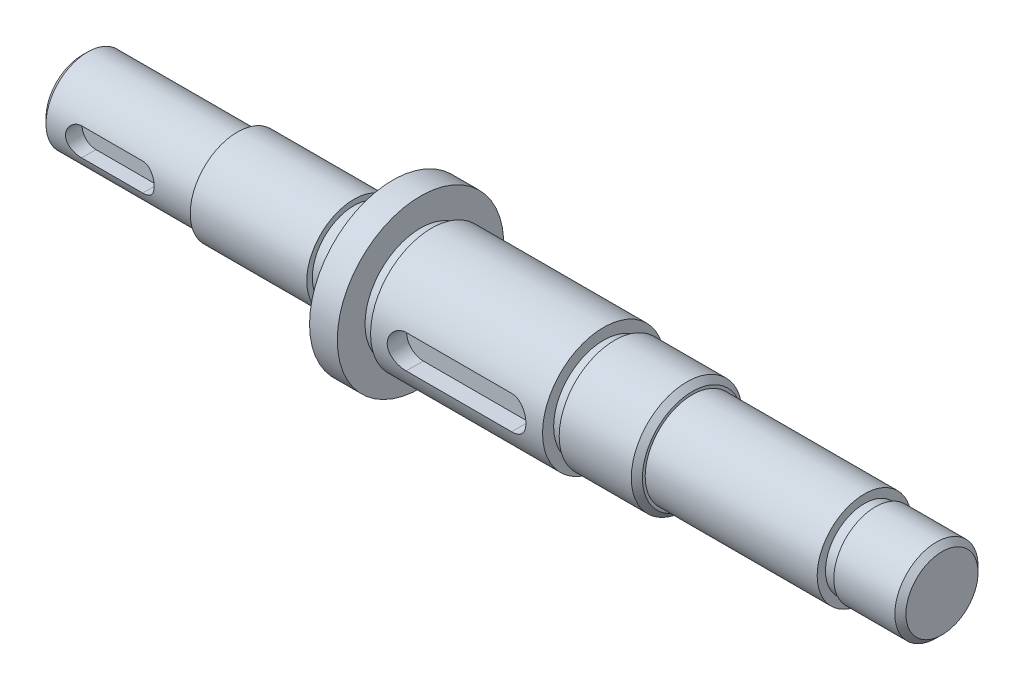
ISO-10303-21;
HEADER;
FILE_DESCRIPTION(('STEP AP214'),'2;1');
FILE_NAME('part.step','',(''),(''),'','','');
FILE_SCHEMA(('AUTOMOTIVE_DESIGN { 1 0 10303 214 1 1 1 1 }'));
ENDSEC;
DATA;
#1=APPLICATION_CONTEXT('core data for automotive mechanical design processes');
#2=APPLICATION_PROTOCOL_DEFINITION('international standard','automotive_design',2000,#1);
#3=PRODUCT_CONTEXT('',#1,'mechanical');
#4=PRODUCT('Part','Part','',(#3));
#5=PRODUCT_RELATED_PRODUCT_CATEGORY('part','',(#4));
#6=PRODUCT_DEFINITION_FORMATION('','',#4);
#7=PRODUCT_DEFINITION_CONTEXT('part definition',#1,'design');
#8=PRODUCT_DEFINITION('design','',#6,#7);
#9=PRODUCT_DEFINITION_SHAPE('','',#8);
#10=(LENGTH_UNIT() NAMED_UNIT(*) SI_UNIT(.MILLI.,.METRE.));
#11=(NAMED_UNIT(*) PLANE_ANGLE_UNIT() SI_UNIT($,.RADIAN.));
#12=(NAMED_UNIT(*) SI_UNIT($,.STERADIAN.) SOLID_ANGLE_UNIT());
#13=UNCERTAINTY_MEASURE_WITH_UNIT(LENGTH_MEASURE(1.E-05),#10,'distance_accuracy_value','');
#14=(GEOMETRIC_REPRESENTATION_CONTEXT(3) GLOBAL_UNCERTAINTY_ASSIGNED_CONTEXT((#13)) GLOBAL_UNIT_ASSIGNED_CONTEXT((#10,
#11,#12)) REPRESENTATION_CONTEXT('',''));
#15=CARTESIAN_POINT('',(0.,0.,0.));
#16=DIRECTION('',(0.,0.,1.));
#17=DIRECTION('',(1.,0.,0.));
#18=AXIS2_PLACEMENT_3D('',#15,#16,#17);
#19=CARTESIAN_POINT('',(0.,0.,0.));
#20=DIRECTION('',(1.,0.,0.));
#21=DIRECTION('',(0.,0.,-1.));
#22=AXIS2_PLACEMENT_3D('',#19,#20,#21);
#23=PLANE('',#22);
#24=CARTESIAN_POINT('',(0.,0.,0.));
#25=DIRECTION('',(1.,0.,0.));
#26=DIRECTION('',(0.,0.,-1.));
#27=AXIS2_PLACEMENT_3D('',#24,#25,#26);
#28=CIRCLE('',#27,6.49999999999998);
#29=CARTESIAN_POINT('',(0.,0.,-6.49999999999998));
#30=VERTEX_POINT('',#29);
#31=EDGE_CURVE('E368',#30,#30,#28,.F.);
#32=ORIENTED_EDGE('',*,*,#31,.T.);
#33=EDGE_LOOP('',(#32));
#34=FACE_BOUND('',#33,.T.);
#35=ADVANCED_FACE('F37',(#34),#23,.F.);
#36=CARTESIAN_POINT('',(0.,0.,0.));
#37=DIRECTION('',(-1.,0.,0.));
#38=DIRECTION('',(0.,0.,1.));
#39=AXIS2_PLACEMENT_3D('',#36,#37,#38);
#40=CYLINDRICAL_SURFACE('',#39,7.5);
#41=CARTESIAN_POINT('',(1.00000000000002,0.,0.));
#42=DIRECTION('',(1.,0.,0.));
#43=DIRECTION('',(0.,0.,-1.));
#44=AXIS2_PLACEMENT_3D('',#41,#42,#43);
#45=CIRCLE('',#44,7.5);
#46=CARTESIAN_POINT('',(1.00000000000002,0.,-7.5));
#47=VERTEX_POINT('',#46);
#48=EDGE_CURVE('E364',#47,#47,#45,.T.);
#49=ORIENTED_EDGE('',*,*,#48,.T.);
#50=EDGE_LOOP('',(#49));
#51=FACE_BOUND('',#50,.T.);
#52=DIRECTION('',(-1.,0.,0.));
#53=VECTOR('',#52,1.);
#54=CARTESIAN_POINT('',(0.,-2.5,7.07106781186547));
#55=LINE('',#54,#53);
#56=CARTESIAN_POINT('',(18.,-2.5,7.07106781186547));
#57=VERTEX_POINT('',#56);
#58=CARTESIAN_POINT('',(7.,-2.5,7.07106781186547));
#59=VERTEX_POINT('',#58);
#60=EDGE_CURVE('E687',#57,#59,#55,.T.);
#61=ORIENTED_EDGE('',*,*,#60,.T.);
#62=CARTESIAN_POINT('',(7.,-2.5,7.07106781186547));
#63=CARTESIAN_POINT('',(6.93179292217968,-2.50000899110406,7.07105693273157));
#64=CARTESIAN_POINT('',(6.86359192532461,-2.49720887221585,7.07205443904569));
#65=CARTESIAN_POINT('',(6.72771896165074,-2.48606045780471,7.07598524121007));
#66=CARTESIAN_POINT('',(6.66004685701195,-2.47771365997202,7.07891801450642));
#67=CARTESIAN_POINT('',(6.52590951164545,-2.45557459422796,7.08662705252507));
#68=CARTESIAN_POINT('',(6.45944129744913,-2.44179847763136,7.09139784850118));
#69=CARTESIAN_POINT('',(6.3279917314172,-2.4089418103012,7.10262619906002));
#70=CARTESIAN_POINT('',(6.2630104334101,-2.38986106786032,7.10908381460331));
#71=CARTESIAN_POINT('',(6.07103842028539,-2.32491551306196,7.13069940793912));
#72=CARTESIAN_POINT('',(5.94682084253002,-2.2713141681025,7.14811243884051));
#73=CARTESIAN_POINT('',(5.70912318853661,-2.14517784106255,7.1869703408752));
#74=CARTESIAN_POINT('',(5.59564976421981,-2.07263123268532,7.20841768551077));
#75=CARTESIAN_POINT('',(5.3782070965292,-1.90762995846819,7.25386182389479));
#76=CARTESIAN_POINT('',(5.2747148572318,-1.81456284630833,7.27792189428067));
#77=CARTESIAN_POINT('',(5.08448289676631,-1.61247071190512,7.32534626726038));
#78=CARTESIAN_POINT('',(4.997746158681,-1.50344285413658,7.34871044533518));
#79=CARTESIAN_POINT('',(4.84130177573754,-1.26900922493972,7.39284706096344));
#80=CARTESIAN_POINT('',(4.77209769225776,-1.14325025284461,7.41353593532888));
#81=CARTESIAN_POINT('',(4.6560192175653,-0.881073095475288,7.44924021883279));
#82=CARTESIAN_POINT('',(4.60913800507429,-0.744658181225883,7.46425736081204));
#83=CARTESIAN_POINT('',(4.54066072374174,-0.470073371182908,7.48647677762783));
#84=CARTESIAN_POINT('',(4.51824182904278,-0.332129588153742,7.49393272446142));
#85=CARTESIAN_POINT('',(4.49670924326149,-0.0542474216361983,7.50109021034827));
#86=CARTESIAN_POINT('',(4.49758999908424,0.0856904786402175,7.50079359709905));
#87=CARTESIAN_POINT('',(4.52211071040049,0.357759612692406,7.49265096581776));
#88=CARTESIAN_POINT('',(4.54485659560473,0.489981756428176,7.48510152476447));
#89=CARTESIAN_POINT('',(4.61098299597919,0.748610161077315,7.46367401253772));
#90=CARTESIAN_POINT('',(4.65436465532526,0.875016099077739,7.44979559044789));
#91=CARTESIAN_POINT('',(4.76105342419445,1.12038155754035,7.41689170677793));
#92=CARTESIAN_POINT('',(4.82461511285762,1.23922126412503,7.39780094595656));
#93=CARTESIAN_POINT('',(4.96964987842497,1.46481147275367,7.35645969200236));
#94=CARTESIAN_POINT('',(5.05112782760212,1.57155867428943,7.33420833994017));
#95=CARTESIAN_POINT('',(5.23417762500695,1.77524334927518,7.28765679856813));
#96=CARTESIAN_POINT('',(5.33651385902825,1.87148402903098,7.26330946699776));
#97=CARTESIAN_POINT('',(5.55610372428643,2.04568006205172,7.21618726182137));
#98=CARTESIAN_POINT('',(5.67336215600703,2.12362950795974,7.19341289789386));
#99=CARTESIAN_POINT('',(5.92170044588429,2.26000831398175,7.15175078440791));
#100=CARTESIAN_POINT('',(6.05295878733264,2.31813252376915,7.13292537370586));
#101=CARTESIAN_POINT('',(6.3241174439746,2.41115057675285,7.10202742655098));
#102=CARTESIAN_POINT('',(6.46400373343032,2.4460810901384,7.08994423522482));
#103=CARTESIAN_POINT('',(6.67104659186998,2.47914539070207,7.078413552368));
#104=CARTESIAN_POINT('',(6.73660347463558,2.48696265313779,7.07566669236505));
#105=CARTESIAN_POINT('',(6.86809519599952,2.49738654017799,7.07199258928497));
#106=CARTESIAN_POINT('',(6.93402943636098,2.49999988848745,7.0710629982382));
#107=CARTESIAN_POINT('',(7.,2.5,7.07106781186548));
#108=B_SPLINE_CURVE_WITH_KNOTS('',3,(#62,#63,#64,#65,#66,#67,#68,#69,#70,#71,#72,#73,#74,#75,
#76,#77,#78,#79,#80,#81,#82,#83,#84,#85,#86,#87,#88,#89,#90,#91,#92,#93,#94,#95,#96,#97,#98,#99,
#100,#101,#102,#103,#104,#105,#106,#107),.UNSPECIFIED.,.F.,.F.,(4,2,2,2,2,2,2,2,2,2,2,2,2,2,2,2,
2,2,2,2,2,2,4),(0.,0.20454621183858,0.409037215423655,0.612924429429075,0.816819012805389,
1.22401016923255,1.63145179965523,2.0532786408839,2.47518051341064,2.90809434014449,
3.34087579484514,3.75860278500203,4.17623021758302,4.57747647846034,4.97874498952315,
5.38529148746615,5.79194868153617,6.21771736826821,6.64362337304802,7.07581676501796,
7.50732520398794,7.70536340013574,7.90314555504337),.UNSPECIFIED.);
#109=CARTESIAN_POINT('',(7.,2.5,7.07106781186548));
#110=VERTEX_POINT('',#109);
#111=EDGE_CURVE('E220',#59,#110,#108,.T.);
#112=ORIENTED_EDGE('',*,*,#111,.T.);
#113=DIRECTION('',(-1.,0.,0.));
#114=VECTOR('',#113,1.);
#115=CARTESIAN_POINT('',(0.,2.5,7.07106781186548));
#116=LINE('',#115,#114);
#117=CARTESIAN_POINT('',(18.,2.5,7.07106781186548));
#118=VERTEX_POINT('',#117);
#119=EDGE_CURVE('E692',#110,#118,#116,.F.);
#120=ORIENTED_EDGE('',*,*,#119,.T.);
#121=CARTESIAN_POINT('',(18.,2.5,7.07106781186548));
#122=CARTESIAN_POINT('',(18.0682070778203,2.50000899110406,7.07105693273157));
#123=CARTESIAN_POINT('',(18.1364080746754,2.49720887221585,7.07205443904569));
#124=CARTESIAN_POINT('',(18.2722810383493,2.4860604578047,7.07598524121007));
#125=CARTESIAN_POINT('',(18.3399531429881,2.47771365997202,7.07891801450642));
#126=CARTESIAN_POINT('',(18.4740904883545,2.45557459422795,7.08662705252507));
#127=CARTESIAN_POINT('',(18.5405587025509,2.44179847763136,7.09139784850118));
#128=CARTESIAN_POINT('',(18.6720082685828,2.4089418103012,7.10262619906002));
#129=CARTESIAN_POINT('',(18.7369895665899,2.38986106786032,7.10908381460331));
#130=CARTESIAN_POINT('',(18.9289615797146,2.32491551306196,7.13069940793911));
#131=CARTESIAN_POINT('',(19.05317915747,2.2713141681025,7.14811243884051));
#132=CARTESIAN_POINT('',(19.2908768114634,2.14517784106255,7.1869703408752));
#133=CARTESIAN_POINT('',(19.4043502357802,2.07263123268532,7.20841768551077));
#134=CARTESIAN_POINT('',(19.6217929034708,1.90762995846819,7.25386182389479));
#135=CARTESIAN_POINT('',(19.7252851427682,1.81456284630833,7.27792189428067));
#136=CARTESIAN_POINT('',(19.9155171032337,1.61247071190512,7.32534626726038));
#137=CARTESIAN_POINT('',(20.002253841319,1.50344285413658,7.34871044533518));
#138=CARTESIAN_POINT('',(20.1586982242625,1.26900922493972,7.39284706096344));
#139=CARTESIAN_POINT('',(20.2279023077422,1.14325025284461,7.41353593532888));
#140=CARTESIAN_POINT('',(20.3439807824347,0.881073095475288,7.44924021883279));
#141=CARTESIAN_POINT('',(20.3908619949257,0.744658181225882,7.46425736081204));
#142=CARTESIAN_POINT('',(20.4593392762583,0.470073371182907,7.48647677762783));
#143=CARTESIAN_POINT('',(20.4817581709572,0.332129588153742,7.49393272446142));
#144=CARTESIAN_POINT('',(20.5032907567385,0.0542474216361993,7.50109021034827));
#145=CARTESIAN_POINT('',(20.5024100009158,-0.0856904786402162,7.50079359709905));
#146=CARTESIAN_POINT('',(20.4778892895995,-0.357759612692404,7.49265096581776));
#147=CARTESIAN_POINT('',(20.4551434043953,-0.489981756428174,7.48510152476447));
#148=CARTESIAN_POINT('',(20.3890170040208,-0.748610161077313,7.46367401253772));
#149=CARTESIAN_POINT('',(20.3456353446747,-0.875016099077738,7.44979559044789));
#150=CARTESIAN_POINT('',(20.2389465758055,-1.12038155754035,7.41689170677793));
#151=CARTESIAN_POINT('',(20.1753848871424,-1.23922126412503,7.39780094595656));
#152=CARTESIAN_POINT('',(20.030350121575,-1.46481147275367,7.35645969200236));
#153=CARTESIAN_POINT('',(19.9488721723979,-1.57155867428944,7.33420833994017));
#154=CARTESIAN_POINT('',(19.7658223749931,-1.77524334927518,7.28765679856813));
#155=CARTESIAN_POINT('',(19.6634861409718,-1.87148402903098,7.26330946699776));
#156=CARTESIAN_POINT('',(19.4438962757136,-2.04568006205173,7.21618726182137));
#157=CARTESIAN_POINT('',(19.326637843993,-2.12362950795974,7.19341289789385));
#158=CARTESIAN_POINT('',(19.0782995541157,-2.26000831398175,7.15175078440791));
#159=CARTESIAN_POINT('',(18.9470412126674,-2.31813252376915,7.13292537370586));
#160=CARTESIAN_POINT('',(18.6758825560254,-2.41115057675285,7.10202742655098));
#161=CARTESIAN_POINT('',(18.5359962665697,-2.4460810901384,7.08994423522482));
#162=CARTESIAN_POINT('',(18.32895340813,-2.47914539070207,7.078413552368));
#163=CARTESIAN_POINT('',(18.2633965253644,-2.48696265313779,7.07566669236505));
#164=CARTESIAN_POINT('',(18.1319048040005,-2.497386540178,7.07199258928497));
#165=CARTESIAN_POINT('',(18.065970563639,-2.49999988848745,7.0710629982382));
#166=CARTESIAN_POINT('',(18.,-2.5,7.07106781186547));
#167=B_SPLINE_CURVE_WITH_KNOTS('',3,(#121,#122,#123,#124,#125,#126,#127,#128,#129,#130,#131,
#132,#133,#134,#135,#136,#137,#138,#139,#140,#141,#142,#143,#144,#145,#146,#147,#148,#149,#150,
#151,#152,#153,#154,#155,#156,#157,#158,#159,#160,#161,#162,#163,#164,#165,#166),.UNSPECIFIED.,
.F.,.F.,(4,2,2,2,2,2,2,2,2,2,2,2,2,2,2,2,2,2,2,2,2,2,4),(0.,0.204546211838584,0.409037215423656,
0.612924429429074,0.816819012805387,1.22401016923255,1.63145179965523,2.0532786408839,
2.47518051341064,2.90809434014449,3.34087579484514,3.75860278500203,4.17623021758301,
4.57747647846033,4.97874498952315,5.38529148746615,5.79194868153617,6.21771736826821,
6.64362337304801,7.07581676501795,7.50732520398793,7.70536340013574,7.90314555504337),.UNSPECIFIED.);
#168=EDGE_CURVE('E61',#118,#57,#167,.T.);
#169=ORIENTED_EDGE('',*,*,#168,.T.);
#170=EDGE_LOOP('',(#61,#112,#120,#169));
#171=FACE_BOUND('',#170,.T.);
#172=CARTESIAN_POINT('',(28.,0.,0.));
#173=DIRECTION('',(-1.,0.,0.));
#174=DIRECTION('',(0.,0.,1.));
#175=AXIS2_PLACEMENT_3D('',#172,#173,#174);
#176=CIRCLE('',#175,7.5);
#177=CARTESIAN_POINT('',(28.,0.,7.5));
#178=VERTEX_POINT('',#177);
#179=EDGE_CURVE('E217',#178,#178,#176,.T.);
#180=ORIENTED_EDGE('',*,*,#179,.T.);
#181=EDGE_LOOP('',(#180));
#182=FACE_BOUND('',#181,.T.);
#183=ADVANCED_FACE('F235',(#51,#171,#182),#40,.T.);
#184=CARTESIAN_POINT('',(28.,7.5,0.));
#185=DIRECTION('',(1.,0.,0.));
#186=DIRECTION('',(0.,0.,-1.));
#187=AXIS2_PLACEMENT_3D('',#184,#185,#186);
#188=PLANE('',#187);
#189=ORIENTED_EDGE('',*,*,#179,.F.);
#190=EDGE_LOOP('',(#189));
#191=FACE_BOUND('',#190,.T.);
#192=CARTESIAN_POINT('',(28.,0.,0.));
#193=DIRECTION('',(-1.,0.,0.));
#194=DIRECTION('',(0.,0.,1.));
#195=AXIS2_PLACEMENT_3D('',#192,#193,#194);
#196=CIRCLE('',#195,8.5);
#197=CARTESIAN_POINT('',(28.,0.,8.5));
#198=VERTEX_POINT('',#197);
#199=EDGE_CURVE('E214',#198,#198,#196,.T.);
#200=ORIENTED_EDGE('',*,*,#199,.T.);
#201=EDGE_LOOP('',(#200));
#202=FACE_BOUND('',#201,.T.);
#203=ADVANCED_FACE('F337',(#191,#202),#188,.F.);
#204=CARTESIAN_POINT('',(0.,0.,0.));
#205=DIRECTION('',(-1.,0.,0.));
#206=DIRECTION('',(0.,0.,1.));
#207=AXIS2_PLACEMENT_3D('',#204,#205,#206);
#208=CYLINDRICAL_SURFACE('',#207,8.5);
#209=ORIENTED_EDGE('',*,*,#199,.F.);
#210=EDGE_LOOP('',(#209));
#211=FACE_BOUND('',#210,.T.);
#212=CARTESIAN_POINT('',(49.,0.,0.));
#213=DIRECTION('',(-1.,0.,0.));
#214=DIRECTION('',(0.,0.,1.));
#215=AXIS2_PLACEMENT_3D('',#212,#213,#214);
#216=CIRCLE('',#215,8.5);
#217=CARTESIAN_POINT('',(49.,0.,8.5));
#218=VERTEX_POINT('',#217);
#219=EDGE_CURVE('E211',#218,#218,#216,.T.);
#220=ORIENTED_EDGE('',*,*,#219,.T.);
#221=EDGE_LOOP('',(#220));
#222=FACE_BOUND('',#221,.T.);
#223=ADVANCED_FACE('F580',(#211,#222),#208,.T.);
#224=CARTESIAN_POINT('',(49.,8.5,0.));
#225=DIRECTION('',(-1.,0.,0.));
#226=DIRECTION('',(0.,0.,1.));
#227=AXIS2_PLACEMENT_3D('',#224,#225,#226);
#228=PLANE('',#227);
#229=ORIENTED_EDGE('',*,*,#219,.F.);
#230=EDGE_LOOP('',(#229));
#231=FACE_BOUND('',#230,.T.);
#232=CARTESIAN_POINT('',(49.,0.,0.));
#233=DIRECTION('',(-1.,0.,0.));
#234=DIRECTION('',(0.,0.,1.));
#235=AXIS2_PLACEMENT_3D('',#232,#233,#234);
#236=CIRCLE('',#235,7.5);
#237=CARTESIAN_POINT('',(49.,0.,7.5));
#238=VERTEX_POINT('',#237);
#239=EDGE_CURVE('E208',#238,#238,#236,.T.);
#240=ORIENTED_EDGE('',*,*,#239,.T.);
#241=EDGE_LOOP('',(#240));
#242=FACE_BOUND('',#241,.T.);
#243=ADVANCED_FACE('F570',(#231,#242),#228,.F.);
#244=CARTESIAN_POINT('',(0.,0.,0.));
#245=DIRECTION('',(-1.,0.,0.));
#246=DIRECTION('',(0.,0.,1.));
#247=AXIS2_PLACEMENT_3D('',#244,#245,#246);
#248=CYLINDRICAL_SURFACE('',#247,7.5);
#249=ORIENTED_EDGE('',*,*,#239,.F.);
#250=EDGE_LOOP('',(#249));
#251=FACE_BOUND('',#250,.T.);
#252=CARTESIAN_POINT('',(51.,0.,0.));
#253=DIRECTION('',(-1.,0.,0.));
#254=DIRECTION('',(0.,0.,1.));
#255=AXIS2_PLACEMENT_3D('',#252,#253,#254);
#256=CIRCLE('',#255,7.5);
#257=CARTESIAN_POINT('',(51.,0.,7.5));
#258=VERTEX_POINT('',#257);
#259=EDGE_CURVE('E205',#258,#258,#256,.T.);
#260=ORIENTED_EDGE('',*,*,#259,.T.);
#261=EDGE_LOOP('',(#260));
#262=FACE_BOUND('',#261,.T.);
#263=ADVANCED_FACE('F560',(#251,#262),#248,.T.);
#264=CARTESIAN_POINT('',(51.,7.5,0.));
#265=DIRECTION('',(-1.,0.,0.));
#266=DIRECTION('',(0.,0.,1.));
#267=AXIS2_PLACEMENT_3D('',#264,#265,#266);
#268=PLANE('',#267);
#269=ORIENTED_EDGE('',*,*,#259,.F.);
#270=EDGE_LOOP('',(#269));
#271=FACE_BOUND('',#270,.T.);
#272=CARTESIAN_POINT('',(51.,0.,0.));
#273=DIRECTION('',(-1.,0.,0.));
#274=DIRECTION('',(0.,0.,1.));
#275=AXIS2_PLACEMENT_3D('',#272,#273,#274);
#276=CIRCLE('',#275,5.);
#277=CARTESIAN_POINT('',(51.,0.,5.));
#278=VERTEX_POINT('',#277);
#279=EDGE_CURVE('E202',#278,#278,#276,.T.);
#280=ORIENTED_EDGE('',*,*,#279,.T.);
#281=EDGE_LOOP('',(#280));
#282=FACE_BOUND('',#281,.T.);
#283=ADVANCED_FACE('F550',(#271,#282),#268,.F.);
#284=CARTESIAN_POINT('',(0.,0.,0.));
#285=DIRECTION('',(-1.,0.,0.));
#286=DIRECTION('',(0.,0.,1.));
#287=AXIS2_PLACEMENT_3D('',#284,#285,#286);
#288=CYLINDRICAL_SURFACE('',#287,5.);
#289=ORIENTED_EDGE('',*,*,#279,.F.);
#290=EDGE_LOOP('',(#289));
#291=FACE_BOUND('',#290,.T.);
#292=CARTESIAN_POINT('',(56.,0.,0.));
#293=DIRECTION('',(-1.,0.,0.));
#294=DIRECTION('',(0.,0.,1.));
#295=AXIS2_PLACEMENT_3D('',#292,#293,#294);
#296=CIRCLE('',#295,5.);
#297=CARTESIAN_POINT('',(56.,0.,5.));
#298=VERTEX_POINT('',#297);
#299=EDGE_CURVE('E199',#298,#298,#296,.T.);
#300=ORIENTED_EDGE('',*,*,#299,.T.);
#301=EDGE_LOOP('',(#300));
#302=FACE_BOUND('',#301,.T.);
#303=ADVANCED_FACE('F540',(#291,#302),#288,.T.);
#304=CARTESIAN_POINT('',(56.,5.,0.));
#305=DIRECTION('',(1.,0.,0.));
#306=DIRECTION('',(0.,0.,-1.));
#307=AXIS2_PLACEMENT_3D('',#304,#305,#306);
#308=PLANE('',#307);
#309=ORIENTED_EDGE('',*,*,#299,.F.);
#310=EDGE_LOOP('',(#309));
#311=FACE_BOUND('',#310,.T.);
#312=CARTESIAN_POINT('',(56.,0.,0.));
#313=DIRECTION('',(-1.,0.,0.));
#314=DIRECTION('',(0.,0.,1.));
#315=AXIS2_PLACEMENT_3D('',#312,#313,#314);
#316=CIRCLE('',#315,15.);
#317=CARTESIAN_POINT('',(56.,0.,15.));
#318=VERTEX_POINT('',#317);
#319=EDGE_CURVE('E196',#318,#318,#316,.T.);
#320=ORIENTED_EDGE('',*,*,#319,.T.);
#321=EDGE_LOOP('',(#320));
#322=FACE_BOUND('',#321,.T.);
#323=ADVANCED_FACE('F530',(#311,#322),#308,.F.);
#324=CARTESIAN_POINT('',(0.,0.,0.));
#325=DIRECTION('',(-1.,0.,0.));
#326=DIRECTION('',(0.,0.,1.));
#327=AXIS2_PLACEMENT_3D('',#324,#325,#326);
#328=CYLINDRICAL_SURFACE('',#327,15.);
#329=ORIENTED_EDGE('',*,*,#319,.F.);
#330=EDGE_LOOP('',(#329));
#331=FACE_BOUND('',#330,.T.);
#332=CARTESIAN_POINT('',(61.,0.,0.));
#333=DIRECTION('',(-1.,0.,0.));
#334=DIRECTION('',(0.,0.,1.));
#335=AXIS2_PLACEMENT_3D('',#332,#333,#334);
#336=CIRCLE('',#335,15.);
#337=CARTESIAN_POINT('',(61.,0.,15.));
#338=VERTEX_POINT('',#337);
#339=EDGE_CURVE('E193',#338,#338,#336,.T.);
#340=ORIENTED_EDGE('',*,*,#339,.T.);
#341=EDGE_LOOP('',(#340));
#342=FACE_BOUND('',#341,.T.);
#343=ADVANCED_FACE('F520',(#331,#342),#328,.T.);
#344=CARTESIAN_POINT('',(61.,15.,0.));
#345=DIRECTION('',(-1.,0.,0.));
#346=DIRECTION('',(0.,0.,1.));
#347=AXIS2_PLACEMENT_3D('',#344,#345,#346);
#348=PLANE('',#347);
#349=ORIENTED_EDGE('',*,*,#339,.F.);
#350=EDGE_LOOP('',(#349));
#351=FACE_BOUND('',#350,.T.);
#352=CARTESIAN_POINT('',(61.,0.,0.));
#353=DIRECTION('',(-1.,0.,0.));
#354=DIRECTION('',(0.,0.,1.));
#355=AXIS2_PLACEMENT_3D('',#352,#353,#354);
#356=CIRCLE('',#355,10.);
#357=CARTESIAN_POINT('',(61.,0.,10.));
#358=VERTEX_POINT('',#357);
#359=EDGE_CURVE('E190',#358,#358,#356,.T.);
#360=ORIENTED_EDGE('',*,*,#359,.T.);
#361=EDGE_LOOP('',(#360));
#362=FACE_BOUND('',#361,.T.);
#363=ADVANCED_FACE('F511',(#351,#362),#348,.F.);
#364=CARTESIAN_POINT('',(0.,0.,0.));
#365=DIRECTION('',(-1.,0.,0.));
#366=DIRECTION('',(0.,0.,1.));
#367=AXIS2_PLACEMENT_3D('',#364,#365,#366);
#368=CYLINDRICAL_SURFACE('',#367,10.);
#369=ORIENTED_EDGE('',*,*,#359,.F.);
#370=EDGE_LOOP('',(#369));
#371=FACE_BOUND('',#370,.T.);
#372=CARTESIAN_POINT('',(63.,0.,0.));
#373=DIRECTION('',(-1.,0.,0.));
#374=DIRECTION('',(0.,0.,1.));
#375=AXIS2_PLACEMENT_3D('',#372,#373,#374);
#376=CIRCLE('',#375,10.);
#377=CARTESIAN_POINT('',(63.,0.,10.));
#378=VERTEX_POINT('',#377);
#379=EDGE_CURVE('E187',#378,#378,#376,.T.);
#380=ORIENTED_EDGE('',*,*,#379,.T.);
#381=EDGE_LOOP('',(#380));
#382=FACE_BOUND('',#381,.T.);
#383=ADVANCED_FACE('F502',(#371,#382),#368,.T.);
#384=CARTESIAN_POINT('',(63.,10.,0.));
#385=DIRECTION('',(1.,0.,0.));
#386=DIRECTION('',(0.,0.,-1.));
#387=AXIS2_PLACEMENT_3D('',#384,#385,#386);
#388=PLANE('',#387);
#389=ORIENTED_EDGE('',*,*,#379,.F.);
#390=EDGE_LOOP('',(#389));
#391=FACE_BOUND('',#390,.T.);
#392=CARTESIAN_POINT('',(63.,0.,0.));
#393=DIRECTION('',(-1.,0.,0.));
#394=DIRECTION('',(0.,0.,1.));
#395=AXIS2_PLACEMENT_3D('',#392,#393,#394);
#396=CIRCLE('',#395,11.);
#397=CARTESIAN_POINT('',(63.,0.,11.));
#398=VERTEX_POINT('',#397);
#399=EDGE_CURVE('E184',#398,#398,#396,.T.);
#400=ORIENTED_EDGE('',*,*,#399,.T.);
#401=EDGE_LOOP('',(#400));
#402=FACE_BOUND('',#401,.T.);
#403=ADVANCED_FACE('F303',(#391,#402),#388,.F.);
#404=CARTESIAN_POINT('',(0.,0.,0.));
#405=DIRECTION('',(-1.,0.,0.));
#406=DIRECTION('',(0.,0.,1.));
#407=AXIS2_PLACEMENT_3D('',#404,#405,#406);
#408=CYLINDRICAL_SURFACE('',#407,11.);
#409=DIRECTION('',(-1.,0.,0.));
#410=VECTOR('',#409,1.);
#411=CARTESIAN_POINT('',(0.,-3.,10.5830052442584));
#412=LINE('',#411,#410);
#413=CARTESIAN_POINT('',(88.,-3.,10.5830052442584));
#414=VERTEX_POINT('',#413);
#415=CARTESIAN_POINT('',(69.,-3.,10.5830052442584));
#416=VERTEX_POINT('',#415);
#417=EDGE_CURVE('E377',#414,#416,#412,.T.);
#418=ORIENTED_EDGE('',*,*,#417,.T.);
#419=CARTESIAN_POINT('',(69.,-3.,10.5830052442584));
#420=CARTESIAN_POINT('',(68.9173061085902,-3.00000989976809,10.5829949970026));
#421=CARTESIAN_POINT('',(68.834618295408,-2.99658102723595,10.5839742471726));
#422=CARTESIAN_POINT('',(68.6698664337712,-2.98292268314841,10.5878356752194));
#423=CARTESIAN_POINT('',(68.5878022683709,-2.97269452008914,10.5907174869552));
#424=CARTESIAN_POINT('',(68.4250574878552,-2.94554459027321,10.598299618142));
#425=CARTESIAN_POINT('',(68.3443742106137,-2.9286377012691,10.6029958951229));
#426=CARTESIAN_POINT('',(68.1847967459457,-2.88829120712689,10.6140571066224));
#427=CARTESIAN_POINT('',(68.1059025925916,-2.8648514776895,10.6204220728906));
#428=CARTESIAN_POINT('',(67.872757092836,-2.78500332821793,10.6417494872311));
#429=CARTESIAN_POINT('',(67.7218606051448,-2.71903526586307,10.6589535681767));
#430=CARTESIAN_POINT('',(67.4332946582313,-2.56365897700126,10.6973836998985));
#431=CARTESIAN_POINT('',(67.295629902896,-2.47424245636572,10.7186111730805));
#432=CARTESIAN_POINT('',(67.0337902940215,-2.27200424315806,10.7633148792344));
#433=CARTESIAN_POINT('',(66.9100081217563,-2.15868225262836,10.7868322128172));
#434=CARTESIAN_POINT('',(66.6829485610947,-1.91292298422355,10.8331129950831));
#435=CARTESIAN_POINT('',(66.5796745227067,-1.78048258944453,10.8558763200935));
#436=CARTESIAN_POINT('',(66.3949010932536,-1.49749198480952,10.8985459264206));
#437=CARTESIAN_POINT('',(66.313796920179,-1.34667477161624,10.9183977479742));
#438=CARTESIAN_POINT('',(66.1782515862203,-1.03291980522387,10.9525311229674));
#439=CARTESIAN_POINT('',(66.1238044788681,-0.869984764533407,10.9668139185607));
#440=CARTESIAN_POINT('',(66.0443982650973,-0.540744675896728,10.9879090070619));
#441=CARTESIAN_POINT('',(66.0187656736306,-0.374613167612542,10.9948916417093));
#442=CARTESIAN_POINT('',(65.995595335153,-0.0402673813620229,11.0011960589752));
#443=CARTESIAN_POINT('',(65.9980532838217,0.127946573564695,11.0005190152883));
#444=CARTESIAN_POINT('',(66.0305248758153,0.456980924404257,10.9917041066205));
#445=CARTESIAN_POINT('',(66.0598100267733,0.617879308918087,10.9837634920705));
#446=CARTESIAN_POINT('',(66.1439252158588,0.932383527853144,10.9615477415639));
#447=CARTESIAN_POINT('',(66.1987564916847,1.08598900853898,10.9472722986892));
#448=CARTESIAN_POINT('',(66.332954866807,1.38338788045077,10.9137016176963));
#449=CARTESIAN_POINT('',(66.4125682462387,1.52706425574145,10.8943563157114));
#450=CARTESIAN_POINT('',(66.5938798699065,1.79926098198643,10.8527253375081));
#451=CARTESIAN_POINT('',(66.6955821728122,1.92777854091953,10.830439121215));
#452=CARTESIAN_POINT('',(66.9220232350838,2.17034844112028,10.7844948742978));
#453=CARTESIAN_POINT('',(67.047394553869,2.2838069302889,10.760815765188));
#454=CARTESIAN_POINT('',(67.3156623808701,2.48826234185506,10.7153886222241));
#455=CARTESIAN_POINT('',(67.458563752454,2.57925300980782,10.6936411271564));
#456=CARTESIAN_POINT('',(67.759194812754,2.73667910615422,10.6544469945807));
#457=CARTESIAN_POINT('',(67.9170242427571,2.80293223890785,10.6370325899538));
#458=CARTESIAN_POINT('',(68.242087094527,2.9076832432578,10.6088816209578));
#459=CARTESIAN_POINT('',(68.4093059422751,2.94622291362359,10.598135003286));
#460=CARTESIAN_POINT('',(68.6483544398666,2.98015870664206,10.588613232355));
#461=CARTESIAN_POINT('',(68.7185164597237,2.98759962141261,10.5865140551644));
#462=CARTESIAN_POINT('',(68.8591075532403,2.99751512863222,10.58371035186));
#463=CARTESIAN_POINT('',(68.9295360350585,2.99999749605757,10.5830036423878));
#464=CARTESIAN_POINT('',(69.,3.,10.5830052442584));
#465=B_SPLINE_CURVE_WITH_KNOTS('',3,(#419,#420,#421,#422,#423,#424,#425,#426,#427,#428,#429,
#430,#431,#432,#433,#434,#435,#436,#437,#438,#439,#440,#441,#442,#443,#444,#445,#446,#447,#448,
#449,#450,#451,#452,#453,#454,#455,#456,#457,#458,#459,#460,#461,#462,#463,#464),.UNSPECIFIED.,
.F.,.F.,(4,2,2,2,2,2,2,2,2,2,2,2,2,2,2,2,2,2,2,2,2,2,4),(0.,0.247994395628699,0.495941079544131,
0.743338515979078,0.99074065992621,1.48499724217182,1.97942888795732,2.48547083856629,
2.99159538337129,3.50622794981869,4.02074566333957,4.52296979924472,5.02511698025349,
5.51402000992995,6.00294672920888,6.49689640600088,6.99093691914144,7.50077286033219,
8.01075056671345,8.52441550873707,9.03730408243458,9.24891043373584,9.46018472611219),.UNSPECIFIED.);
#466=CARTESIAN_POINT('',(69.,3.,10.5830052442584));
#467=VERTEX_POINT('',#466);
#468=EDGE_CURVE('E308',#416,#467,#465,.T.);
#469=ORIENTED_EDGE('',*,*,#468,.T.);
#470=DIRECTION('',(-1.,0.,0.));
#471=VECTOR('',#470,1.);
#472=CARTESIAN_POINT('',(0.,3.,10.5830052442584));
#473=LINE('',#472,#471);
#474=CARTESIAN_POINT('',(88.,3.,10.5830052442584));
#475=VERTEX_POINT('',#474);
#476=EDGE_CURVE('E322',#467,#475,#473,.F.);
#477=ORIENTED_EDGE('',*,*,#476,.T.);
#478=CARTESIAN_POINT('',(88.,3.,10.5830052442584));
#479=CARTESIAN_POINT('',(88.0826938914098,3.00000989976809,10.5829949970026));
#480=CARTESIAN_POINT('',(88.1653817045921,2.99658102723595,10.5839742471726));
#481=CARTESIAN_POINT('',(88.3301335662289,2.98292268314841,10.5878356752194));
#482=CARTESIAN_POINT('',(88.4121977316291,2.97269452008914,10.5907174869552));
#483=CARTESIAN_POINT('',(88.5749425121448,2.94554459027321,10.598299618142));
#484=CARTESIAN_POINT('',(88.6556257893863,2.9286377012691,10.6029958951229));
#485=CARTESIAN_POINT('',(88.8152032540543,2.88829120712689,10.6140571066224));
#486=CARTESIAN_POINT('',(88.8940974074084,2.8648514776895,10.6204220728906));
#487=CARTESIAN_POINT('',(89.127242907164,2.78500332821793,10.6417494872311));
#488=CARTESIAN_POINT('',(89.2781393948553,2.71903526586307,10.6589535681767));
#489=CARTESIAN_POINT('',(89.5667053417687,2.56365897700126,10.6973836998985));
#490=CARTESIAN_POINT('',(89.704370097104,2.47424245636572,10.7186111730805));
#491=CARTESIAN_POINT('',(89.9662097059785,2.27200424315806,10.7633148792344));
#492=CARTESIAN_POINT('',(90.0899918782437,2.15868225262836,10.7868322128172));
#493=CARTESIAN_POINT('',(90.3170514389053,1.91292298422354,10.8331129950831));
#494=CARTESIAN_POINT('',(90.4203254772933,1.78048258944453,10.8558763200935));
#495=CARTESIAN_POINT('',(90.6050989067465,1.49749198480952,10.8985459264206));
#496=CARTESIAN_POINT('',(90.686203079821,1.34667477161623,10.9183977479742));
#497=CARTESIAN_POINT('',(90.8217484137797,1.03291980522386,10.9525311229674));
#498=CARTESIAN_POINT('',(90.8761955211319,0.869984764533405,10.9668139185607));
#499=CARTESIAN_POINT('',(90.9556017349027,0.540744675896729,10.9879090070619));
#500=CARTESIAN_POINT('',(90.9812343263694,0.374613167612542,10.9948916417093));
#501=CARTESIAN_POINT('',(91.004404664847,0.0402673813620228,11.0011960589752));
#502=CARTESIAN_POINT('',(91.0019467161784,-0.127946573564695,11.0005190152883));
#503=CARTESIAN_POINT('',(90.9694751241847,-0.456980924404257,10.9917041066205));
#504=CARTESIAN_POINT('',(90.9401899732267,-0.617879308918087,10.9837634920705));
#505=CARTESIAN_POINT('',(90.8560747841413,-0.932383527853144,10.9615477415639));
#506=CARTESIAN_POINT('',(90.8012435083153,-1.08598900853898,10.9472722986892));
#507=CARTESIAN_POINT('',(90.667045133193,-1.38338788045077,10.9137016176963));
#508=CARTESIAN_POINT('',(90.5874317537613,-1.52706425574145,10.8943563157114));
#509=CARTESIAN_POINT('',(90.4061201300935,-1.79926098198643,10.8527253375081));
#510=CARTESIAN_POINT('',(90.3044178271878,-1.92777854091953,10.830439121215));
#511=CARTESIAN_POINT('',(90.0779767649162,-2.17034844112028,10.7844948742978));
#512=CARTESIAN_POINT('',(89.952605446131,-2.2838069302889,10.760815765188));
#513=CARTESIAN_POINT('',(89.6843376191299,-2.48826234185506,10.7153886222241));
#514=CARTESIAN_POINT('',(89.5414362475461,-2.57925300980782,10.6936411271564));
#515=CARTESIAN_POINT('',(89.240805187246,-2.73667910615422,10.6544469945807));
#516=CARTESIAN_POINT('',(89.0829757572429,-2.80293223890785,10.6370325899538));
#517=CARTESIAN_POINT('',(88.7579129054731,-2.9076832432578,10.6088816209578));
#518=CARTESIAN_POINT('',(88.590694057725,-2.94622291362359,10.598135003286));
#519=CARTESIAN_POINT('',(88.3516455601334,-2.98015870664206,10.588613232355));
#520=CARTESIAN_POINT('',(88.2814835402763,-2.98759962141261,10.5865140551644));
#521=CARTESIAN_POINT('',(88.1408924467597,-2.99751512863222,10.58371035186));
#522=CARTESIAN_POINT('',(88.0704639649415,-2.99999749605757,10.5830036423878));
#523=CARTESIAN_POINT('',(88.,-3.,10.5830052442584));
#524=B_SPLINE_CURVE_WITH_KNOTS('',3,(#478,#479,#480,#481,#482,#483,#484,#485,#486,#487,#488,
#489,#490,#491,#492,#493,#494,#495,#496,#497,#498,#499,#500,#501,#502,#503,#504,#505,#506,#507,
#508,#509,#510,#511,#512,#513,#514,#515,#516,#517,#518,#519,#520,#521,#522,#523),.UNSPECIFIED.,
.F.,.F.,(4,2,2,2,2,2,2,2,2,2,2,2,2,2,2,2,2,2,2,2,2,2,4),(0.,0.247994395628699,0.495941079544116,
0.743338515979064,0.99074065992621,1.48499724217182,1.97942888795731,2.48547083856629,
2.99159538337129,3.50622794981869,4.02074566333957,4.52296979924472,5.02511698025349,
5.51402000992995,6.00294672920888,6.49689640600088,6.99093691914144,7.50077286033219,
8.01075056671345,8.52441550873707,9.03730408243458,9.24891043373582,9.46018472611219),.UNSPECIFIED.);
#525=EDGE_CURVE('E53',#475,#414,#524,.T.);
#526=ORIENTED_EDGE('',*,*,#525,.T.);
#527=EDGE_LOOP('',(#418,#469,#477,#526));
#528=FACE_BOUND('',#527,.T.);
#529=ORIENTED_EDGE('',*,*,#399,.F.);
#530=EDGE_LOOP('',(#529));
#531=FACE_BOUND('',#530,.T.);
#532=CARTESIAN_POINT('',(94.,0.,0.));
#533=DIRECTION('',(-1.,0.,0.));
#534=DIRECTION('',(0.,0.,1.));
#535=AXIS2_PLACEMENT_3D('',#532,#533,#534);
#536=CIRCLE('',#535,11.);
#537=CARTESIAN_POINT('',(94.,0.,11.));
#538=VERTEX_POINT('',#537);
#539=EDGE_CURVE('E181',#538,#538,#536,.T.);
#540=ORIENTED_EDGE('',*,*,#539,.T.);
#541=EDGE_LOOP('',(#540));
#542=FACE_BOUND('',#541,.T.);
#543=ADVANCED_FACE('F298',(#528,#531,#542),#408,.T.);
#544=CARTESIAN_POINT('',(94.,11.,0.));
#545=DIRECTION('',(-1.,0.,0.));
#546=DIRECTION('',(0.,0.,1.));
#547=AXIS2_PLACEMENT_3D('',#544,#545,#546);
#548=PLANE('',#547);
#549=ORIENTED_EDGE('',*,*,#539,.F.);
#550=EDGE_LOOP('',(#549));
#551=FACE_BOUND('',#550,.T.);
#552=CARTESIAN_POINT('',(94.,0.,0.));
#553=DIRECTION('',(-1.,0.,0.));
#554=DIRECTION('',(0.,0.,1.));
#555=AXIS2_PLACEMENT_3D('',#552,#553,#554);
#556=CIRCLE('',#555,9.);
#557=CARTESIAN_POINT('',(94.,0.,9.));
#558=VERTEX_POINT('',#557);
#559=EDGE_CURVE('E178',#558,#558,#556,.T.);
#560=ORIENTED_EDGE('',*,*,#559,.T.);
#561=EDGE_LOOP('',(#560));
#562=FACE_BOUND('',#561,.T.);
#563=ADVANCED_FACE('F294',(#551,#562),#548,.F.);
#564=CARTESIAN_POINT('',(0.,0.,0.));
#565=DIRECTION('',(-1.,0.,0.));
#566=DIRECTION('',(0.,0.,1.));
#567=AXIS2_PLACEMENT_3D('',#564,#565,#566);
#568=CYLINDRICAL_SURFACE('',#567,9.);
#569=ORIENTED_EDGE('',*,*,#559,.F.);
#570=EDGE_LOOP('',(#569));
#571=FACE_BOUND('',#570,.T.);
#572=CARTESIAN_POINT('',(96.,0.,0.));
#573=DIRECTION('',(-1.,0.,0.));
#574=DIRECTION('',(0.,0.,1.));
#575=AXIS2_PLACEMENT_3D('',#572,#573,#574);
#576=CIRCLE('',#575,9.);
#577=CARTESIAN_POINT('',(96.,0.,9.));
#578=VERTEX_POINT('',#577);
#579=EDGE_CURVE('E175',#578,#578,#576,.T.);
#580=ORIENTED_EDGE('',*,*,#579,.T.);
#581=EDGE_LOOP('',(#580));
#582=FACE_BOUND('',#581,.T.);
#583=ADVANCED_FACE('F290',(#571,#582),#568,.T.);
#584=CARTESIAN_POINT('',(96.,9.,0.));
#585=DIRECTION('',(1.,0.,0.));
#586=DIRECTION('',(0.,0.,-1.));
#587=AXIS2_PLACEMENT_3D('',#584,#585,#586);
#588=PLANE('',#587);
#589=ORIENTED_EDGE('',*,*,#579,.F.);
#590=EDGE_LOOP('',(#589));
#591=FACE_BOUND('',#590,.T.);
#592=CARTESIAN_POINT('',(96.,0.,0.));
#593=DIRECTION('',(-1.,0.,0.));
#594=DIRECTION('',(0.,0.,1.));
#595=AXIS2_PLACEMENT_3D('',#592,#593,#594);
#596=CIRCLE('',#595,10.);
#597=CARTESIAN_POINT('',(96.,0.,10.));
#598=VERTEX_POINT('',#597);
#599=EDGE_CURVE('E172',#598,#598,#596,.T.);
#600=ORIENTED_EDGE('',*,*,#599,.T.);
#601=EDGE_LOOP('',(#600));
#602=FACE_BOUND('',#601,.T.);
#603=ADVANCED_FACE('F286',(#591,#602),#588,.F.);
#604=CARTESIAN_POINT('',(0.,0.,0.));
#605=DIRECTION('',(-1.,0.,0.));
#606=DIRECTION('',(0.,0.,1.));
#607=AXIS2_PLACEMENT_3D('',#604,#605,#606);
#608=CYLINDRICAL_SURFACE('',#607,10.);
#609=CARTESIAN_POINT('',(109.,0.,0.));
#610=DIRECTION('',(-1.,0.,0.));
#611=DIRECTION('',(0.,0.,1.));
#612=AXIS2_PLACEMENT_3D('',#609,#610,#611);
#613=CIRCLE('',#612,10.);
#614=CARTESIAN_POINT('',(109.,0.,10.));
#615=VERTEX_POINT('',#614);
#616=EDGE_CURVE('E46',#615,#615,#613,.T.);
#617=ORIENTED_EDGE('',*,*,#616,.T.);
#618=EDGE_LOOP('',(#617));
#619=FACE_BOUND('',#618,.T.);
#620=ORIENTED_EDGE('',*,*,#599,.F.);
#621=EDGE_LOOP('',(#620));
#622=FACE_BOUND('',#621,.T.);
#623=ADVANCED_FACE('F282',(#619,#622),#608,.T.);
#624=CARTESIAN_POINT('',(110.,10.,0.));
#625=DIRECTION('',(-1.,0.,0.));
#626=DIRECTION('',(0.,0.,1.));
#627=AXIS2_PLACEMENT_3D('',#624,#625,#626);
#628=PLANE('',#627);
#629=CARTESIAN_POINT('',(110.,0.,0.));
#630=DIRECTION('',(-1.,0.,0.));
#631=DIRECTION('',(0.,0.,1.));
#632=AXIS2_PLACEMENT_3D('',#629,#630,#631);
#633=CIRCLE('',#632,8.99999999999999);
#634=CARTESIAN_POINT('',(110.,0.,8.99999999999999));
#635=VERTEX_POINT('',#634);
#636=EDGE_CURVE('E11',#635,#635,#633,.F.);
#637=ORIENTED_EDGE('',*,*,#636,.T.);
#638=EDGE_LOOP('',(#637));
#639=FACE_BOUND('',#638,.T.);
#640=CARTESIAN_POINT('',(110.,0.,0.));
#641=DIRECTION('',(-1.,0.,0.));
#642=DIRECTION('',(0.,0.,1.));
#643=AXIS2_PLACEMENT_3D('',#640,#641,#642);
#644=CIRCLE('',#643,8.5);
#645=CARTESIAN_POINT('',(110.,0.,8.5));
#646=VERTEX_POINT('',#645);
#647=EDGE_CURVE('E169',#646,#646,#644,.T.);
#648=ORIENTED_EDGE('',*,*,#647,.T.);
#649=EDGE_LOOP('',(#648));
#650=FACE_BOUND('',#649,.T.);
#651=ADVANCED_FACE('F278',(#639,#650),#628,.F.);
#652=CARTESIAN_POINT('',(0.,0.,0.));
#653=DIRECTION('',(-1.,0.,0.));
#654=DIRECTION('',(0.,0.,1.));
#655=AXIS2_PLACEMENT_3D('',#652,#653,#654);
#656=CYLINDRICAL_SURFACE('',#655,8.5);
#657=ORIENTED_EDGE('',*,*,#647,.F.);
#658=EDGE_LOOP('',(#657));
#659=FACE_BOUND('',#658,.T.);
#660=CARTESIAN_POINT('',(141.,0.,0.));
#661=DIRECTION('',(-1.,0.,0.));
#662=DIRECTION('',(0.,0.,1.));
#663=AXIS2_PLACEMENT_3D('',#660,#661,#662);
#664=CIRCLE('',#663,8.5);
#665=CARTESIAN_POINT('',(141.,0.,8.5));
#666=VERTEX_POINT('',#665);
#667=EDGE_CURVE('E166',#666,#666,#664,.T.);
#668=ORIENTED_EDGE('',*,*,#667,.T.);
#669=EDGE_LOOP('',(#668));
#670=FACE_BOUND('',#669,.T.);
#671=ADVANCED_FACE('F274',(#659,#670),#656,.T.);
#672=CARTESIAN_POINT('',(141.,8.5,0.));
#673=DIRECTION('',(-1.,0.,0.));
#674=DIRECTION('',(0.,0.,1.));
#675=AXIS2_PLACEMENT_3D('',#672,#673,#674);
#676=PLANE('',#675);
#677=ORIENTED_EDGE('',*,*,#667,.F.);
#678=EDGE_LOOP('',(#677));
#679=FACE_BOUND('',#678,.T.);
#680=CARTESIAN_POINT('',(141.,0.,0.));
#681=DIRECTION('',(-1.,0.,0.));
#682=DIRECTION('',(0.,0.,1.));
#683=AXIS2_PLACEMENT_3D('',#680,#681,#682);
#684=CIRCLE('',#683,7.);
#685=CARTESIAN_POINT('',(141.,0.,7.));
#686=VERTEX_POINT('',#685);
#687=EDGE_CURVE('E163',#686,#686,#684,.T.);
#688=ORIENTED_EDGE('',*,*,#687,.T.);
#689=EDGE_LOOP('',(#688));
#690=FACE_BOUND('',#689,.T.);
#691=ADVANCED_FACE('F270',(#679,#690),#676,.F.);
#692=CARTESIAN_POINT('',(0.,0.,0.));
#693=DIRECTION('',(-1.,0.,0.));
#694=DIRECTION('',(0.,0.,1.));
#695=AXIS2_PLACEMENT_3D('',#692,#693,#694);
#696=CYLINDRICAL_SURFACE('',#695,7.);
#697=ORIENTED_EDGE('',*,*,#687,.F.);
#698=EDGE_LOOP('',(#697));
#699=FACE_BOUND('',#698,.T.);
#700=CARTESIAN_POINT('',(143.,0.,0.));
#701=DIRECTION('',(-1.,0.,0.));
#702=DIRECTION('',(0.,0.,1.));
#703=AXIS2_PLACEMENT_3D('',#700,#701,#702);
#704=CIRCLE('',#703,7.);
#705=CARTESIAN_POINT('',(143.,0.,7.));
#706=VERTEX_POINT('',#705);
#707=EDGE_CURVE('E160',#706,#706,#704,.T.);
#708=ORIENTED_EDGE('',*,*,#707,.T.);
#709=EDGE_LOOP('',(#708));
#710=FACE_BOUND('',#709,.T.);
#711=ADVANCED_FACE('F266',(#699,#710),#696,.T.);
#712=CARTESIAN_POINT('',(143.,7.,0.));
#713=DIRECTION('',(1.,0.,0.));
#714=DIRECTION('',(0.,0.,-1.));
#715=AXIS2_PLACEMENT_3D('',#712,#713,#714);
#716=PLANE('',#715);
#717=ORIENTED_EDGE('',*,*,#707,.F.);
#718=EDGE_LOOP('',(#717));
#719=FACE_BOUND('',#718,.T.);
#720=CARTESIAN_POINT('',(143.,0.,0.));
#721=DIRECTION('',(-1.,0.,0.));
#722=DIRECTION('',(0.,0.,1.));
#723=AXIS2_PLACEMENT_3D('',#720,#721,#722);
#724=CIRCLE('',#723,7.5);
#725=CARTESIAN_POINT('',(143.,0.,7.5));
#726=VERTEX_POINT('',#725);
#727=EDGE_CURVE('E150',#726,#726,#724,.T.);
#728=ORIENTED_EDGE('',*,*,#727,.T.);
#729=EDGE_LOOP('',(#728));
#730=FACE_BOUND('',#729,.T.);
#731=ADVANCED_FACE('F262',(#719,#730),#716,.F.);
#732=CARTESIAN_POINT('',(0.,0.,0.));
#733=DIRECTION('',(-1.,0.,0.));
#734=DIRECTION('',(0.,0.,1.));
#735=AXIS2_PLACEMENT_3D('',#732,#733,#734);
#736=CYLINDRICAL_SURFACE('',#735,7.5);
#737=CARTESIAN_POINT('',(154.,0.,0.));
#738=DIRECTION('',(-1.,0.,0.));
#739=DIRECTION('',(0.,0.,1.));
#740=AXIS2_PLACEMENT_3D('',#737,#738,#739);
#741=CIRCLE('',#740,7.5);
#742=CARTESIAN_POINT('',(154.,0.,7.5));
#743=VERTEX_POINT('',#742);
#744=EDGE_CURVE('E363',#743,#743,#741,.T.);
#745=ORIENTED_EDGE('',*,*,#744,.T.);
#746=EDGE_LOOP('',(#745));
#747=FACE_BOUND('',#746,.T.);
#748=ORIENTED_EDGE('',*,*,#727,.F.);
#749=EDGE_LOOP('',(#748));
#750=FACE_BOUND('',#749,.T.);
#751=ADVANCED_FACE('F258',(#747,#750),#736,.T.);
#752=CARTESIAN_POINT('',(155.,7.5,0.));
#753=DIRECTION('',(-1.,0.,0.));
#754=DIRECTION('',(0.,0.,1.));
#755=AXIS2_PLACEMENT_3D('',#752,#753,#754);
#756=PLANE('',#755);
#757=CARTESIAN_POINT('',(155.,0.,0.));
#758=DIRECTION('',(-1.,0.,0.));
#759=DIRECTION('',(0.,0.,1.));
#760=AXIS2_PLACEMENT_3D('',#757,#758,#759);
#761=CIRCLE('',#760,6.49999999999999);
#762=CARTESIAN_POINT('',(155.,0.,6.49999999999999));
#763=VERTEX_POINT('',#762);
#764=EDGE_CURVE('E360',#763,#763,#761,.F.);
#765=ORIENTED_EDGE('',*,*,#764,.T.);
#766=EDGE_LOOP('',(#765));
#767=FACE_BOUND('',#766,.T.);
#768=ADVANCED_FACE('F255',(#767),#756,.F.);
#769=CARTESIAN_POINT('',(18.,0.,4.5));
#770=DIRECTION('',(0.,0.,1.));
#771=DIRECTION('',(1.,0.,0.));
#772=AXIS2_PLACEMENT_3D('',#769,#770,#771);
#773=CYLINDRICAL_SURFACE('',#772,2.5);
#774=DIRECTION('',(0.,0.,1.));
#775=VECTOR('',#774,1.);
#776=CARTESIAN_POINT('',(18.,2.5,4.5));
#777=LINE('',#776,#775);
#778=CARTESIAN_POINT('',(18.,2.5,4.5));
#779=VERTEX_POINT('',#778);
#780=EDGE_CURVE('E147',#779,#118,#777,.T.);
#781=ORIENTED_EDGE('',*,*,#780,.F.);
#782=CARTESIAN_POINT('',(18.,0.,4.5));
#783=DIRECTION('',(0.,0.,1.));
#784=DIRECTION('',(1.,0.,0.));
#785=AXIS2_PLACEMENT_3D('',#782,#783,#784);
#786=CIRCLE('',#785,2.5);
#787=CARTESIAN_POINT('',(18.,-2.5,4.5));
#788=VERTEX_POINT('',#787);
#789=EDGE_CURVE('E131',#788,#779,#786,.T.);
#790=ORIENTED_EDGE('',*,*,#789,.F.);
#791=DIRECTION('',(0.,0.,1.));
#792=VECTOR('',#791,1.);
#793=CARTESIAN_POINT('',(18.,-2.5,4.5));
#794=LINE('',#793,#792);
#795=EDGE_CURVE('E148',#788,#57,#794,.T.);
#796=ORIENTED_EDGE('',*,*,#795,.T.);
#797=ORIENTED_EDGE('',*,*,#168,.F.);
#798=EDGE_LOOP('',(#781,#790,#796,#797));
#799=FACE_BOUND('',#798,.T.);
#800=ADVANCED_FACE('F251',(#799),#773,.F.);
#801=CARTESIAN_POINT('',(18.,-2.5,4.5));
#802=DIRECTION('',(0.,-1.,0.));
#803=DIRECTION('',(1.,0.,0.));
#804=AXIS2_PLACEMENT_3D('',#801,#802,#803);
#805=PLANE('',#804);
#806=ORIENTED_EDGE('',*,*,#795,.F.);
#807=DIRECTION('',(1.,0.,0.));
#808=VECTOR('',#807,1.);
#809=CARTESIAN_POINT('',(18.,-2.5,4.5));
#810=LINE('',#809,#808);
#811=CARTESIAN_POINT('',(7.,-2.5,4.5));
#812=VERTEX_POINT('',#811);
#813=EDGE_CURVE('E144',#812,#788,#810,.T.);
#814=ORIENTED_EDGE('',*,*,#813,.F.);
#815=DIRECTION('',(0.,0.,1.));
#816=VECTOR('',#815,1.);
#817=CARTESIAN_POINT('',(7.,-2.5,4.5));
#818=LINE('',#817,#816);
#819=EDGE_CURVE('E151',#812,#59,#818,.T.);
#820=ORIENTED_EDGE('',*,*,#819,.T.);
#821=ORIENTED_EDGE('',*,*,#60,.F.);
#822=EDGE_LOOP('',(#806,#814,#820,#821));
#823=FACE_BOUND('',#822,.T.);
#824=ADVANCED_FACE('F245',(#823),#805,.F.);
#825=CARTESIAN_POINT('',(7.,0.,4.5));
#826=DIRECTION('',(0.,0.,1.));
#827=DIRECTION('',(1.,0.,0.));
#828=AXIS2_PLACEMENT_3D('',#825,#826,#827);
#829=CYLINDRICAL_SURFACE('',#828,2.5);
#830=ORIENTED_EDGE('',*,*,#819,.F.);
#831=CARTESIAN_POINT('',(7.,0.,4.5));
#832=DIRECTION('',(0.,0.,1.));
#833=DIRECTION('',(1.,0.,0.));
#834=AXIS2_PLACEMENT_3D('',#831,#832,#833);
#835=CIRCLE('',#834,2.5);
#836=CARTESIAN_POINT('',(7.,2.5,4.5));
#837=VERTEX_POINT('',#836);
#838=EDGE_CURVE('E141',#837,#812,#835,.T.);
#839=ORIENTED_EDGE('',*,*,#838,.F.);
#840=DIRECTION('',(0.,0.,1.));
#841=VECTOR('',#840,1.);
#842=CARTESIAN_POINT('',(7.,2.5,4.5));
#843=LINE('',#842,#841);
#844=EDGE_CURVE('E154',#837,#110,#843,.T.);
#845=ORIENTED_EDGE('',*,*,#844,.T.);
#846=ORIENTED_EDGE('',*,*,#111,.F.);
#847=EDGE_LOOP('',(#830,#839,#845,#846));
#848=FACE_BOUND('',#847,.T.);
#849=ADVANCED_FACE('F239',(#848),#829,.F.);
#850=CARTESIAN_POINT('',(18.,2.5,4.5));
#851=DIRECTION('',(0.,1.,0.));
#852=DIRECTION('',(-1.,0.,0.));
#853=AXIS2_PLACEMENT_3D('',#850,#851,#852);
#854=PLANE('',#853);
#855=ORIENTED_EDGE('',*,*,#844,.F.);
#856=DIRECTION('',(-1.,0.,0.));
#857=VECTOR('',#856,1.);
#858=CARTESIAN_POINT('',(18.,2.5,4.5));
#859=LINE('',#858,#857);
#860=EDGE_CURVE('E138',#779,#837,#859,.T.);
#861=ORIENTED_EDGE('',*,*,#860,.F.);
#862=ORIENTED_EDGE('',*,*,#780,.T.);
#863=ORIENTED_EDGE('',*,*,#119,.F.);
#864=EDGE_LOOP('',(#855,#861,#862,#863));
#865=FACE_BOUND('',#864,.T.);
#866=ADVANCED_FACE('F244',(#865),#854,.F.);
#867=CARTESIAN_POINT('',(18.,0.,4.5));
#868=DIRECTION('',(0.,0.,1.));
#869=DIRECTION('',(1.,0.,0.));
#870=AXIS2_PLACEMENT_3D('',#867,#868,#869);
#871=PLANE('',#870);
#872=ORIENTED_EDGE('',*,*,#789,.T.);
#873=ORIENTED_EDGE('',*,*,#860,.T.);
#874=ORIENTED_EDGE('',*,*,#838,.T.);
#875=ORIENTED_EDGE('',*,*,#813,.T.);
#876=EDGE_LOOP('',(#872,#873,#874,#875));
#877=FACE_BOUND('',#876,.T.);
#878=ADVANCED_FACE('F249',(#877),#871,.T.);
#879=CARTESIAN_POINT('',(88.,0.,7.5));
#880=DIRECTION('',(0.,0.,1.));
#881=DIRECTION('',(1.,0.,0.));
#882=AXIS2_PLACEMENT_3D('',#879,#880,#881);
#883=CYLINDRICAL_SURFACE('',#882,3.);
#884=DIRECTION('',(0.,0.,1.));
#885=VECTOR('',#884,1.);
#886=CARTESIAN_POINT('',(88.,3.,7.5));
#887=LINE('',#886,#885);
#888=CARTESIAN_POINT('',(88.,3.,7.5));
#889=VERTEX_POINT('',#888);
#890=EDGE_CURVE('E103',#889,#475,#887,.T.);
#891=ORIENTED_EDGE('',*,*,#890,.F.);
#892=CARTESIAN_POINT('',(88.,0.,7.5));
#893=DIRECTION('',(0.,0.,1.));
#894=DIRECTION('',(1.,0.,0.));
#895=AXIS2_PLACEMENT_3D('',#892,#893,#894);
#896=CIRCLE('',#895,3.);
#897=CARTESIAN_POINT('',(88.,-3.,7.5));
#898=VERTEX_POINT('',#897);
#899=EDGE_CURVE('E107',#898,#889,#896,.T.);
#900=ORIENTED_EDGE('',*,*,#899,.F.);
#901=DIRECTION('',(0.,0.,1.));
#902=VECTOR('',#901,1.);
#903=CARTESIAN_POINT('',(88.,-3.,7.5));
#904=LINE('',#903,#902);
#905=EDGE_CURVE('E129',#898,#414,#904,.T.);
#906=ORIENTED_EDGE('',*,*,#905,.T.);
#907=ORIENTED_EDGE('',*,*,#525,.F.);
#908=EDGE_LOOP('',(#891,#900,#906,#907));
#909=FACE_BOUND('',#908,.T.);
#910=ADVANCED_FACE('F105',(#909),#883,.F.);
#911=CARTESIAN_POINT('',(88.,-3.,7.5));
#912=DIRECTION('',(0.,-1.,0.));
#913=DIRECTION('',(0.,0.,-1.));
#914=AXIS2_PLACEMENT_3D('',#911,#912,#913);
#915=PLANE('',#914);
#916=ORIENTED_EDGE('',*,*,#905,.F.);
#917=DIRECTION('',(1.,0.,0.));
#918=VECTOR('',#917,1.);
#919=CARTESIAN_POINT('',(88.,-3.,7.5));
#920=LINE('',#919,#918);
#921=CARTESIAN_POINT('',(69.,-3.,7.5));
#922=VERTEX_POINT('',#921);
#923=EDGE_CURVE('E112',#922,#898,#920,.T.);
#924=ORIENTED_EDGE('',*,*,#923,.F.);
#925=DIRECTION('',(0.,0.,1.));
#926=VECTOR('',#925,1.);
#927=CARTESIAN_POINT('',(69.,-3.,7.5));
#928=LINE('',#927,#926);
#929=EDGE_CURVE('E132',#922,#416,#928,.T.);
#930=ORIENTED_EDGE('',*,*,#929,.T.);
#931=ORIENTED_EDGE('',*,*,#417,.F.);
#932=EDGE_LOOP('',(#916,#924,#930,#931));
#933=FACE_BOUND('',#932,.T.);
#934=ADVANCED_FACE('F327',(#933),#915,.F.);
#935=CARTESIAN_POINT('',(69.,0.,7.5));
#936=DIRECTION('',(0.,0.,1.));
#937=DIRECTION('',(1.,0.,0.));
#938=AXIS2_PLACEMENT_3D('',#935,#936,#937);
#939=CYLINDRICAL_SURFACE('',#938,3.);
#940=ORIENTED_EDGE('',*,*,#929,.F.);
#941=CARTESIAN_POINT('',(69.,0.,7.5));
#942=DIRECTION('',(0.,0.,1.));
#943=DIRECTION('',(1.,0.,0.));
#944=AXIS2_PLACEMENT_3D('',#941,#942,#943);
#945=CIRCLE('',#944,3.);
#946=CARTESIAN_POINT('',(69.,3.,7.5));
#947=VERTEX_POINT('',#946);
#948=EDGE_CURVE('E121',#947,#922,#945,.T.);
#949=ORIENTED_EDGE('',*,*,#948,.F.);
#950=DIRECTION('',(0.,0.,1.));
#951=VECTOR('',#950,1.);
#952=CARTESIAN_POINT('',(69.,3.,7.5));
#953=LINE('',#952,#951);
#954=EDGE_CURVE('E111',#947,#467,#953,.T.);
#955=ORIENTED_EDGE('',*,*,#954,.T.);
#956=ORIENTED_EDGE('',*,*,#468,.F.);
#957=EDGE_LOOP('',(#940,#949,#955,#956));
#958=FACE_BOUND('',#957,.T.);
#959=ADVANCED_FACE('F382',(#958),#939,.F.);
#960=CARTESIAN_POINT('',(88.,3.,7.5));
#961=DIRECTION('',(0.,1.,0.));
#962=DIRECTION('',(0.,0.,1.));
#963=AXIS2_PLACEMENT_3D('',#960,#961,#962);
#964=PLANE('',#963);
#965=ORIENTED_EDGE('',*,*,#954,.F.);
#966=DIRECTION('',(-1.,0.,0.));
#967=VECTOR('',#966,1.);
#968=CARTESIAN_POINT('',(88.,3.,7.5));
#969=LINE('',#968,#967);
#970=EDGE_CURVE('E115',#889,#947,#969,.T.);
#971=ORIENTED_EDGE('',*,*,#970,.F.);
#972=ORIENTED_EDGE('',*,*,#890,.T.);
#973=ORIENTED_EDGE('',*,*,#476,.F.);
#974=EDGE_LOOP('',(#965,#971,#972,#973));
#975=FACE_BOUND('',#974,.T.);
#976=ADVANCED_FACE('F116',(#975),#964,.F.);
#977=CARTESIAN_POINT('',(88.,0.,7.5));
#978=DIRECTION('',(0.,0.,1.));
#979=DIRECTION('',(1.,0.,0.));
#980=AXIS2_PLACEMENT_3D('',#977,#978,#979);
#981=PLANE('',#980);
#982=ORIENTED_EDGE('',*,*,#899,.T.);
#983=ORIENTED_EDGE('',*,*,#970,.T.);
#984=ORIENTED_EDGE('',*,*,#948,.T.);
#985=ORIENTED_EDGE('',*,*,#923,.T.);
#986=EDGE_LOOP('',(#982,#983,#984,#985));
#987=FACE_BOUND('',#986,.T.);
#988=ADVANCED_FACE('F123',(#987),#981,.T.);
#989=CARTESIAN_POINT('',(0.,0.,0.));
#990=DIRECTION('',(1.,0.,0.));
#991=DIRECTION('',(0.,0.,-1.));
#992=AXIS2_PLACEMENT_3D('',#989,#990,#991);
#993=CONICAL_SURFACE('',#992,6.49999999999998,0.78539816339745);
#994=ORIENTED_EDGE('',*,*,#48,.F.);
#995=EDGE_LOOP('',(#994));
#996=FACE_BOUND('',#995,.T.);
#997=ORIENTED_EDGE('',*,*,#31,.F.);
#998=EDGE_LOOP('',(#997));
#999=FACE_BOUND('',#998,.T.);
#1000=ADVANCED_FACE('F342',(#996,#999),#993,.T.);
#1001=CARTESIAN_POINT('',(154.,0.,0.));
#1002=DIRECTION('',(-1.,0.,0.));
#1003=DIRECTION('',(0.,0.,1.));
#1004=AXIS2_PLACEMENT_3D('',#1001,#1002,#1003);
#1005=CONICAL_SURFACE('',#1004,7.5,0.785398163397438);
#1006=ORIENTED_EDGE('',*,*,#764,.F.);
#1007=EDGE_LOOP('',(#1006));
#1008=FACE_BOUND('',#1007,.T.);
#1009=ORIENTED_EDGE('',*,*,#744,.F.);
#1010=EDGE_LOOP('',(#1009));
#1011=FACE_BOUND('',#1010,.T.);
#1012=ADVANCED_FACE('F347',(#1008,#1011),#1005,.T.);
#1013=CARTESIAN_POINT('',(109.,0.,0.));
#1014=DIRECTION('',(-1.,0.,0.));
#1015=DIRECTION('',(0.,0.,1.));
#1016=AXIS2_PLACEMENT_3D('',#1013,#1014,#1015);
#1017=CONICAL_SURFACE('',#1016,10.,0.785398163397444);
#1018=ORIENTED_EDGE('',*,*,#636,.F.);
#1019=EDGE_LOOP('',(#1018));
#1020=FACE_BOUND('',#1019,.T.);
#1021=ORIENTED_EDGE('',*,*,#616,.F.);
#1022=EDGE_LOOP('',(#1021));
#1023=FACE_BOUND('',#1022,.T.);
#1024=ADVANCED_FACE('F40',(#1020,#1023),#1017,.T.);
#1025=CLOSED_SHELL('',(#35,#183,#203,#223,#243,#263,#283,#303,#323,#343,#363,#383,#403,#543,
#563,#583,#603,#623,#651,#671,#691,#711,#731,#751,#768,#800,#824,#849,#866,#878,#910,#934,#959,
#976,#988,#1000,#1012,#1024));
#1026=MANIFOLD_SOLID_BREP('B2',#1025);
#1027=ADVANCED_BREP_SHAPE_REPRESENTATION('',(#18,#1026),#14);
#1028=SHAPE_DEFINITION_REPRESENTATION(#9,#1027);
ENDSEC;
END-ISO-10303-21;
